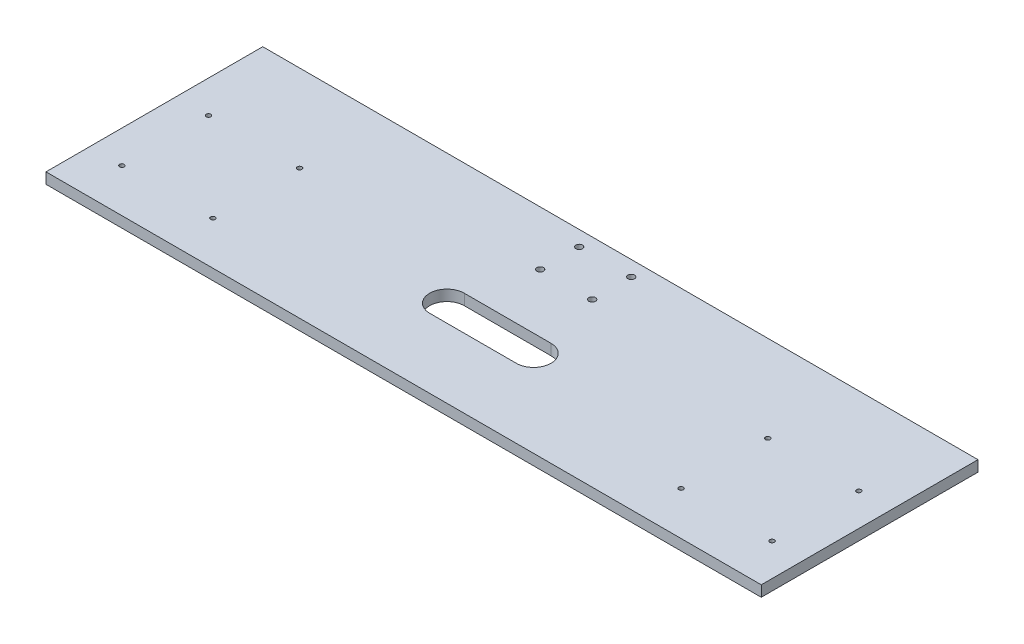
ISO-10303-21;
HEADER;
FILE_DESCRIPTION(('STEP AP214'),'2;1');
FILE_NAME('part.step','',(''),(''),'','','');
FILE_SCHEMA(('AUTOMOTIVE_DESIGN { 1 0 10303 214 1 1 1 1 }'));
ENDSEC;
DATA;
#1=APPLICATION_CONTEXT('core data for automotive mechanical design processes');
#2=APPLICATION_PROTOCOL_DEFINITION('international standard','automotive_design',2000,#1);
#3=PRODUCT_CONTEXT('',#1,'mechanical');
#4=PRODUCT('Part','Part','',(#3));
#5=PRODUCT_RELATED_PRODUCT_CATEGORY('part','',(#4));
#6=PRODUCT_DEFINITION_FORMATION('','',#4);
#7=PRODUCT_DEFINITION_CONTEXT('part definition',#1,'design');
#8=PRODUCT_DEFINITION('design','',#6,#7);
#9=PRODUCT_DEFINITION_SHAPE('','',#8);
#10=(LENGTH_UNIT() NAMED_UNIT(*) SI_UNIT(.MILLI.,.METRE.));
#11=(NAMED_UNIT(*) PLANE_ANGLE_UNIT() SI_UNIT($,.RADIAN.));
#12=(NAMED_UNIT(*) SI_UNIT($,.STERADIAN.) SOLID_ANGLE_UNIT());
#13=UNCERTAINTY_MEASURE_WITH_UNIT(LENGTH_MEASURE(1.E-05),#10,'distance_accuracy_value','');
#14=(GEOMETRIC_REPRESENTATION_CONTEXT(3) GLOBAL_UNCERTAINTY_ASSIGNED_CONTEXT((#13)) GLOBAL_UNIT_ASSIGNED_CONTEXT((#10,
#11,#12)) REPRESENTATION_CONTEXT('',''));
#15=CARTESIAN_POINT('',(0.,0.,0.));
#16=DIRECTION('',(0.,0.,1.));
#17=DIRECTION('',(1.,0.,0.));
#18=AXIS2_PLACEMENT_3D('',#15,#16,#17);
#19=CARTESIAN_POINT('',(-155.369649805448,5.,90.2723735408561));
#20=DIRECTION('',(1.,0.,0.));
#21=DIRECTION('',(0.,0.,-1.));
#22=AXIS2_PLACEMENT_3D('',#19,#20,#21);
#23=PLANE('',#22);
#24=DIRECTION('',(0.,0.,1.));
#25=VECTOR('',#24,1.);
#26=CARTESIAN_POINT('',(-155.369649805448,0.,90.2723735408561));
#27=LINE('',#26,#25);
#28=CARTESIAN_POINT('',(-155.369649805448,0.,90.2723735408561));
#29=VERTEX_POINT('',#28);
#30=CARTESIAN_POINT('',(-155.369649805447,0.,190.272373540856));
#31=VERTEX_POINT('',#30);
#32=EDGE_CURVE('E203',#29,#31,#27,.T.);
#33=ORIENTED_EDGE('',*,*,#32,.T.);
#34=DIRECTION('',(0.,-1.,0.));
#35=VECTOR('',#34,1.);
#36=CARTESIAN_POINT('',(-155.369649805447,5.,190.272373540856));
#37=LINE('',#36,#35);
#38=CARTESIAN_POINT('',(-155.369649805447,5.,190.272373540856));
#39=VERTEX_POINT('',#38);
#40=EDGE_CURVE('E11',#39,#31,#37,.T.);
#41=ORIENTED_EDGE('',*,*,#40,.F.);
#42=DIRECTION('',(0.,0.,1.));
#43=VECTOR('',#42,1.);
#44=CARTESIAN_POINT('',(-155.369649805448,5.,90.2723735408561));
#45=LINE('',#44,#43);
#46=CARTESIAN_POINT('',(-155.369649805448,5.,90.2723735408561));
#47=VERTEX_POINT('',#46);
#48=EDGE_CURVE('E206',#47,#39,#45,.T.);
#49=ORIENTED_EDGE('',*,*,#48,.F.);
#50=DIRECTION('',(0.,-1.,0.));
#51=VECTOR('',#50,1.);
#52=CARTESIAN_POINT('',(-155.369649805448,5.,90.2723735408561));
#53=LINE('',#52,#51);
#54=EDGE_CURVE('E216',#47,#29,#53,.T.);
#55=ORIENTED_EDGE('',*,*,#54,.T.);
#56=EDGE_LOOP('',(#33,#41,#49,#55));
#57=FACE_BOUND('',#56,.T.);
#58=ADVANCED_FACE('F35',(#57),#23,.F.);
#59=CARTESIAN_POINT('',(-155.369649805447,5.,190.272373540856));
#60=DIRECTION('',(0.,0.,-1.));
#61=DIRECTION('',(-1.,0.,0.));
#62=AXIS2_PLACEMENT_3D('',#59,#60,#61);
#63=PLANE('',#62);
#64=DIRECTION('',(1.,0.,0.));
#65=VECTOR('',#64,1.);
#66=CARTESIAN_POINT('',(-155.369649805447,0.,190.272373540856));
#67=LINE('',#66,#65);
#68=CARTESIAN_POINT('',(174.630350194553,0.,190.272373540856));
#69=VERTEX_POINT('',#68);
#70=EDGE_CURVE('E219',#31,#69,#67,.T.);
#71=ORIENTED_EDGE('',*,*,#70,.T.);
#72=DIRECTION('',(0.,-1.,0.));
#73=VECTOR('',#72,1.);
#74=CARTESIAN_POINT('',(174.630350194553,5.,190.272373540856));
#75=LINE('',#74,#73);
#76=CARTESIAN_POINT('',(174.630350194553,5.,190.272373540856));
#77=VERTEX_POINT('',#76);
#78=EDGE_CURVE('E42',#77,#69,#75,.T.);
#79=ORIENTED_EDGE('',*,*,#78,.F.);
#80=DIRECTION('',(1.,0.,0.));
#81=VECTOR('',#80,1.);
#82=CARTESIAN_POINT('',(-155.369649805447,5.,190.272373540856));
#83=LINE('',#82,#81);
#84=EDGE_CURVE('E209',#39,#77,#83,.T.);
#85=ORIENTED_EDGE('',*,*,#84,.F.);
#86=ORIENTED_EDGE('',*,*,#40,.T.);
#87=EDGE_LOOP('',(#71,#79,#85,#86));
#88=FACE_BOUND('',#87,.T.);
#89=ADVANCED_FACE('F248',(#88),#63,.F.);
#90=CARTESIAN_POINT('',(174.630350194553,5.,90.2723735408561));
#91=DIRECTION('',(-1.,0.,0.));
#92=DIRECTION('',(0.,0.,1.));
#93=AXIS2_PLACEMENT_3D('',#90,#91,#92);
#94=PLANE('',#93);
#95=DIRECTION('',(0.,0.,-1.));
#96=VECTOR('',#95,1.);
#97=CARTESIAN_POINT('',(174.630350194553,0.,90.2723735408561));
#98=LINE('',#97,#96);
#99=CARTESIAN_POINT('',(174.630350194553,0.,90.2723735408561));
#100=VERTEX_POINT('',#99);
#101=EDGE_CURVE('E221',#69,#100,#98,.T.);
#102=ORIENTED_EDGE('',*,*,#101,.T.);
#103=DIRECTION('',(0.,-1.,0.));
#104=VECTOR('',#103,1.);
#105=CARTESIAN_POINT('',(174.630350194553,5.,90.2723735408561));
#106=LINE('',#105,#104);
#107=CARTESIAN_POINT('',(174.630350194553,5.,90.2723735408561));
#108=VERTEX_POINT('',#107);
#109=EDGE_CURVE('E226',#108,#100,#106,.T.);
#110=ORIENTED_EDGE('',*,*,#109,.F.);
#111=DIRECTION('',(0.,0.,-1.));
#112=VECTOR('',#111,1.);
#113=CARTESIAN_POINT('',(174.630350194553,5.,90.2723735408561));
#114=LINE('',#113,#112);
#115=EDGE_CURVE('E212',#77,#108,#114,.T.);
#116=ORIENTED_EDGE('',*,*,#115,.F.);
#117=ORIENTED_EDGE('',*,*,#78,.T.);
#118=EDGE_LOOP('',(#102,#110,#116,#117));
#119=FACE_BOUND('',#118,.T.);
#120=ADVANCED_FACE('F233',(#119),#94,.F.);
#121=CARTESIAN_POINT('',(-155.369649805448,5.,90.2723735408561));
#122=DIRECTION('',(0.,0.,1.));
#123=DIRECTION('',(1.,0.,0.));
#124=AXIS2_PLACEMENT_3D('',#121,#122,#123);
#125=PLANE('',#124);
#126=DIRECTION('',(-1.,0.,0.));
#127=VECTOR('',#126,1.);
#128=CARTESIAN_POINT('',(-155.369649805448,0.,90.2723735408561));
#129=LINE('',#128,#127);
#130=EDGE_CURVE('E210',#100,#29,#129,.T.);
#131=ORIENTED_EDGE('',*,*,#130,.T.);
#132=ORIENTED_EDGE('',*,*,#54,.F.);
#133=DIRECTION('',(-1.,0.,0.));
#134=VECTOR('',#133,1.);
#135=CARTESIAN_POINT('',(-155.369649805448,5.,90.2723735408561));
#136=LINE('',#135,#134);
#137=EDGE_CURVE('E214',#108,#47,#136,.T.);
#138=ORIENTED_EDGE('',*,*,#137,.F.);
#139=ORIENTED_EDGE('',*,*,#109,.T.);
#140=EDGE_LOOP('',(#131,#132,#138,#139));
#141=FACE_BOUND('',#140,.T.);
#142=ADVANCED_FACE('F241',(#141),#125,.F.);
#143=CARTESIAN_POINT('',(0.,5.,0.));
#144=DIRECTION('',(0.,1.,0.));
#145=DIRECTION('',(0.,0.,1.));
#146=AXIS2_PLACEMENT_3D('',#143,#144,#145);
#147=PLANE('',#146);
#148=CARTESIAN_POINT('',(117.630350194553,5.,170.272373540856));
#149=DIRECTION('',(0.,1.,0.));
#150=DIRECTION('',(0.,0.,-1.));
#151=AXIS2_PLACEMENT_3D('',#148,#149,#150);
#152=CIRCLE('',#151,1.04999999999999);
#153=CARTESIAN_POINT('',(117.630350194553,5.,169.222373540856));
#154=VERTEX_POINT('',#153);
#155=EDGE_CURVE('E142',#154,#154,#152,.T.);
#156=ORIENTED_EDGE('',*,*,#155,.F.);
#157=EDGE_LOOP('',(#156));
#158=FACE_BOUND('',#157,.T.);
#159=CARTESIAN_POINT('',(159.630350194553,5.,130.272373540856));
#160=DIRECTION('',(0.,1.,0.));
#161=DIRECTION('',(0.,0.,1.));
#162=AXIS2_PLACEMENT_3D('',#159,#160,#161);
#163=CIRCLE('',#162,1.04999999999999);
#164=CARTESIAN_POINT('',(159.630350194553,5.,131.322373540856));
#165=VERTEX_POINT('',#164);
#166=EDGE_CURVE('E148',#165,#165,#163,.T.);
#167=ORIENTED_EDGE('',*,*,#166,.F.);
#168=EDGE_LOOP('',(#167));
#169=FACE_BOUND('',#168,.T.);
#170=CARTESIAN_POINT('',(159.630350194553,5.,170.272373540856));
#171=DIRECTION('',(0.,1.,0.));
#172=DIRECTION('',(0.,0.,-1.));
#173=AXIS2_PLACEMENT_3D('',#170,#171,#172);
#174=CIRCLE('',#173,1.04999999999999);
#175=CARTESIAN_POINT('',(159.630350194553,5.,169.222373540856));
#176=VERTEX_POINT('',#175);
#177=EDGE_CURVE('E123',#176,#176,#174,.T.);
#178=ORIENTED_EDGE('',*,*,#177,.F.);
#179=EDGE_LOOP('',(#178));
#180=FACE_BOUND('',#179,.T.);
#181=CARTESIAN_POINT('',(-10.3696498054475,5.,150.272373540856));
#182=DIRECTION('',(0.,1.,0.));
#183=DIRECTION('',(0.,0.,1.));
#184=AXIS2_PLACEMENT_3D('',#181,#182,#183);
#185=CIRCLE('',#184,8.00000000000001);
#186=CARTESIAN_POINT('',(-10.3696498054475,5.,142.272373540856));
#187=VERTEX_POINT('',#186);
#188=CARTESIAN_POINT('',(-10.3696498054475,5.,158.272373540856));
#189=VERTEX_POINT('',#188);
#190=EDGE_CURVE('E49',#187,#189,#185,.T.);
#191=ORIENTED_EDGE('',*,*,#190,.F.);
#192=DIRECTION('',(-1.,0.,0.));
#193=VECTOR('',#192,1.);
#194=CARTESIAN_POINT('',(-10.3696498054475,5.,142.272373540856));
#195=LINE('',#194,#193);
#196=CARTESIAN_POINT('',(29.6303501945525,5.,142.272373540856));
#197=VERTEX_POINT('',#196);
#198=EDGE_CURVE('E117',#197,#187,#195,.T.);
#199=ORIENTED_EDGE('',*,*,#198,.F.);
#200=CARTESIAN_POINT('',(29.6303501945525,5.,150.272373540856));
#201=DIRECTION('',(0.,1.,0.));
#202=DIRECTION('',(0.,0.,1.));
#203=AXIS2_PLACEMENT_3D('',#200,#201,#202);
#204=CIRCLE('',#203,8.00000000000001);
#205=CARTESIAN_POINT('',(29.6303501945525,5.,158.272373540856));
#206=VERTEX_POINT('',#205);
#207=EDGE_CURVE('E120',#206,#197,#204,.T.);
#208=ORIENTED_EDGE('',*,*,#207,.F.);
#209=DIRECTION('',(1.,0.,0.));
#210=VECTOR('',#209,1.);
#211=CARTESIAN_POINT('',(-10.3696498054475,5.,158.272373540856));
#212=LINE('',#211,#210);
#213=EDGE_CURVE('E129',#189,#206,#212,.T.);
#214=ORIENTED_EDGE('',*,*,#213,.F.);
#215=EDGE_LOOP('',(#191,#199,#208,#214));
#216=FACE_BOUND('',#215,.T.);
#217=CARTESIAN_POINT('',(-140.369649805448,5.,130.272373540856));
#218=DIRECTION('',(0.,1.,0.));
#219=DIRECTION('',(0.,0.,-1.));
#220=AXIS2_PLACEMENT_3D('',#217,#218,#219);
#221=CIRCLE('',#220,1.04999999999999);
#222=CARTESIAN_POINT('',(-140.369649805448,5.,129.222373540856));
#223=VERTEX_POINT('',#222);
#224=EDGE_CURVE('E168',#223,#223,#221,.T.);
#225=ORIENTED_EDGE('',*,*,#224,.F.);
#226=EDGE_LOOP('',(#225));
#227=FACE_BOUND('',#226,.T.);
#228=CARTESIAN_POINT('',(-98.3696498054475,5.,170.272373540856));
#229=DIRECTION('',(0.,1.,0.));
#230=DIRECTION('',(0.,0.,1.));
#231=AXIS2_PLACEMENT_3D('',#228,#229,#230);
#232=CIRCLE('',#231,1.04999999999999);
#233=CARTESIAN_POINT('',(-98.3696498054475,5.,171.322373540856));
#234=VERTEX_POINT('',#233);
#235=EDGE_CURVE('E155',#234,#234,#232,.T.);
#236=ORIENTED_EDGE('',*,*,#235,.F.);
#237=EDGE_LOOP('',(#236));
#238=FACE_BOUND('',#237,.T.);
#239=CARTESIAN_POINT('',(-98.3696498054475,5.,130.272373540856));
#240=DIRECTION('',(0.,1.,0.));
#241=DIRECTION('',(0.,0.,-1.));
#242=AXIS2_PLACEMENT_3D('',#239,#240,#241);
#243=CIRCLE('',#242,1.04999999999999);
#244=CARTESIAN_POINT('',(-98.3696498054475,5.,129.222373540856));
#245=VERTEX_POINT('',#244);
#246=EDGE_CURVE('E156',#245,#245,#243,.T.);
#247=ORIENTED_EDGE('',*,*,#246,.F.);
#248=EDGE_LOOP('',(#247));
#249=FACE_BOUND('',#248,.T.);
#250=CARTESIAN_POINT('',(117.630350194553,5.,130.272373540856));
#251=DIRECTION('',(0.,1.,0.));
#252=DIRECTION('',(0.,0.,1.));
#253=AXIS2_PLACEMENT_3D('',#250,#251,#252);
#254=CIRCLE('',#253,1.04999999999999);
#255=CARTESIAN_POINT('',(117.630350194553,5.,131.322373540856));
#256=VERTEX_POINT('',#255);
#257=EDGE_CURVE('E141',#256,#256,#254,.T.);
#258=ORIENTED_EDGE('',*,*,#257,.F.);
#259=EDGE_LOOP('',(#258));
#260=FACE_BOUND('',#259,.T.);
#261=CARTESIAN_POINT('',(-140.369649805448,5.,170.272373540856));
#262=DIRECTION('',(0.,1.,0.));
#263=DIRECTION('',(0.,0.,1.));
#264=AXIS2_PLACEMENT_3D('',#261,#262,#263);
#265=CIRCLE('',#264,1.04999999999999);
#266=CARTESIAN_POINT('',(-140.369649805448,5.,171.322373540856));
#267=VERTEX_POINT('',#266);
#268=EDGE_CURVE('E167',#267,#267,#265,.T.);
#269=ORIENTED_EDGE('',*,*,#268,.F.);
#270=EDGE_LOOP('',(#269));
#271=FACE_BOUND('',#270,.T.);
#272=CARTESIAN_POINT('',(21.6303501945525,5.,97.2723735408561));
#273=DIRECTION('',(0.,1.,0.));
#274=DIRECTION('',(0.,0.,-1.));
#275=AXIS2_PLACEMENT_3D('',#272,#273,#274);
#276=CIRCLE('',#275,1.515);
#277=CARTESIAN_POINT('',(21.6303501945525,5.,95.7573735408561));
#278=VERTEX_POINT('',#277);
#279=EDGE_CURVE('E186',#278,#278,#276,.T.);
#280=ORIENTED_EDGE('',*,*,#279,.F.);
#281=EDGE_LOOP('',(#280));
#282=FACE_BOUND('',#281,.T.);
#283=CARTESIAN_POINT('',(-2.36964980544749,5.,115.272373540856));
#284=DIRECTION('',(0.,1.,0.));
#285=DIRECTION('',(0.,0.,1.));
#286=AXIS2_PLACEMENT_3D('',#283,#284,#285);
#287=CIRCLE('',#286,1.51499999999999);
#288=CARTESIAN_POINT('',(-2.36964980544749,5.,116.787373540856));
#289=VERTEX_POINT('',#288);
#290=EDGE_CURVE('E192',#289,#289,#287,.T.);
#291=ORIENTED_EDGE('',*,*,#290,.F.);
#292=EDGE_LOOP('',(#291));
#293=FACE_BOUND('',#292,.T.);
#294=CARTESIAN_POINT('',(21.6303501945525,5.,115.272373540856));
#295=DIRECTION('',(0.,1.,0.));
#296=DIRECTION('',(0.,0.,-1.));
#297=AXIS2_PLACEMENT_3D('',#294,#295,#296);
#298=CIRCLE('',#297,1.515);
#299=CARTESIAN_POINT('',(21.6303501945525,5.,113.757373540856));
#300=VERTEX_POINT('',#299);
#301=EDGE_CURVE('E179',#300,#300,#298,.T.);
#302=ORIENTED_EDGE('',*,*,#301,.F.);
#303=EDGE_LOOP('',(#302));
#304=FACE_BOUND('',#303,.T.);
#305=CARTESIAN_POINT('',(-2.36964980544749,5.,97.2723735408561));
#306=DIRECTION('',(0.,1.,0.));
#307=DIRECTION('',(0.,0.,1.));
#308=AXIS2_PLACEMENT_3D('',#305,#306,#307);
#309=CIRCLE('',#308,1.51499999999999);
#310=CARTESIAN_POINT('',(-2.36964980544749,5.,98.7873735408561));
#311=VERTEX_POINT('',#310);
#312=EDGE_CURVE('E185',#311,#311,#309,.T.);
#313=ORIENTED_EDGE('',*,*,#312,.F.);
#314=EDGE_LOOP('',(#313));
#315=FACE_BOUND('',#314,.T.);
#316=ORIENTED_EDGE('',*,*,#48,.T.);
#317=ORIENTED_EDGE('',*,*,#84,.T.);
#318=ORIENTED_EDGE('',*,*,#115,.T.);
#319=ORIENTED_EDGE('',*,*,#137,.T.);
#320=EDGE_LOOP('',(#316,#317,#318,#319));
#321=FACE_BOUND('',#320,.T.);
#322=ADVANCED_FACE('F247',(#158,#169,#180,#216,#227,#238,#249,#260,#271,#282,#293,#304,#315,
#321),#147,.T.);
#323=CARTESIAN_POINT('',(0.,0.,0.));
#324=DIRECTION('',(0.,1.,0.));
#325=DIRECTION('',(0.,0.,1.));
#326=AXIS2_PLACEMENT_3D('',#323,#324,#325);
#327=PLANE('',#326);
#328=CARTESIAN_POINT('',(117.630350194553,0.,170.272373540856));
#329=DIRECTION('',(0.,1.,0.));
#330=DIRECTION('',(0.,0.,-1.));
#331=AXIS2_PLACEMENT_3D('',#328,#329,#330);
#332=CIRCLE('',#331,1.04999999999999);
#333=CARTESIAN_POINT('',(117.630350194553,0.,169.222373540856));
#334=VERTEX_POINT('',#333);
#335=EDGE_CURVE('E138',#334,#334,#332,.T.);
#336=ORIENTED_EDGE('',*,*,#335,.T.);
#337=EDGE_LOOP('',(#336));
#338=FACE_BOUND('',#337,.T.);
#339=CARTESIAN_POINT('',(159.630350194553,0.,130.272373540856));
#340=DIRECTION('',(0.,1.,0.));
#341=DIRECTION('',(0.,0.,1.));
#342=AXIS2_PLACEMENT_3D('',#339,#340,#341);
#343=CIRCLE('',#342,1.04999999999999);
#344=CARTESIAN_POINT('',(159.630350194553,0.,131.322373540856));
#345=VERTEX_POINT('',#344);
#346=EDGE_CURVE('E145',#345,#345,#343,.T.);
#347=ORIENTED_EDGE('',*,*,#346,.T.);
#348=EDGE_LOOP('',(#347));
#349=FACE_BOUND('',#348,.T.);
#350=CARTESIAN_POINT('',(159.630350194553,0.,170.272373540856));
#351=DIRECTION('',(0.,1.,0.));
#352=DIRECTION('',(0.,0.,-1.));
#353=AXIS2_PLACEMENT_3D('',#350,#351,#352);
#354=CIRCLE('',#353,1.04999999999999);
#355=CARTESIAN_POINT('',(159.630350194553,0.,169.222373540856));
#356=VERTEX_POINT('',#355);
#357=EDGE_CURVE('E151',#356,#356,#354,.T.);
#358=ORIENTED_EDGE('',*,*,#357,.T.);
#359=EDGE_LOOP('',(#358));
#360=FACE_BOUND('',#359,.T.);
#361=DIRECTION('',(-1.,0.,0.));
#362=VECTOR('',#361,1.);
#363=CARTESIAN_POINT('',(-10.3696498054475,0.,142.272373540856));
#364=LINE('',#363,#362);
#365=CARTESIAN_POINT('',(29.6303501945525,0.,142.272373540856));
#366=VERTEX_POINT('',#365);
#367=CARTESIAN_POINT('',(-10.3696498054475,0.,142.272373540856));
#368=VERTEX_POINT('',#367);
#369=EDGE_CURVE('E107',#366,#368,#364,.T.);
#370=ORIENTED_EDGE('',*,*,#369,.T.);
#371=CARTESIAN_POINT('',(-10.3696498054475,0.,150.272373540856));
#372=DIRECTION('',(0.,1.,0.));
#373=DIRECTION('',(0.,0.,1.));
#374=AXIS2_PLACEMENT_3D('',#371,#372,#373);
#375=CIRCLE('',#374,8.00000000000001);
#376=CARTESIAN_POINT('',(-10.3696498054475,0.,158.272373540856));
#377=VERTEX_POINT('',#376);
#378=EDGE_CURVE('E101',#368,#377,#375,.T.);
#379=ORIENTED_EDGE('',*,*,#378,.T.);
#380=DIRECTION('',(1.,0.,0.));
#381=VECTOR('',#380,1.);
#382=CARTESIAN_POINT('',(-10.3696498054475,0.,158.272373540856));
#383=LINE('',#382,#381);
#384=CARTESIAN_POINT('',(29.6303501945525,0.,158.272373540856));
#385=VERTEX_POINT('',#384);
#386=EDGE_CURVE('E110',#377,#385,#383,.T.);
#387=ORIENTED_EDGE('',*,*,#386,.T.);
#388=CARTESIAN_POINT('',(29.6303501945525,0.,150.272373540856));
#389=DIRECTION('',(0.,1.,0.));
#390=DIRECTION('',(0.,0.,1.));
#391=AXIS2_PLACEMENT_3D('',#388,#389,#390);
#392=CIRCLE('',#391,8.00000000000001);
#393=EDGE_CURVE('E57',#385,#366,#392,.T.);
#394=ORIENTED_EDGE('',*,*,#393,.T.);
#395=EDGE_LOOP('',(#370,#379,#387,#394));
#396=FACE_BOUND('',#395,.T.);
#397=CARTESIAN_POINT('',(-140.369649805448,0.,130.272373540856));
#398=DIRECTION('',(0.,1.,0.));
#399=DIRECTION('',(0.,0.,-1.));
#400=AXIS2_PLACEMENT_3D('',#397,#398,#399);
#401=CIRCLE('',#400,1.04999999999999);
#402=CARTESIAN_POINT('',(-140.369649805448,0.,129.222373540856));
#403=VERTEX_POINT('',#402);
#404=EDGE_CURVE('E164',#403,#403,#401,.T.);
#405=ORIENTED_EDGE('',*,*,#404,.T.);
#406=EDGE_LOOP('',(#405));
#407=FACE_BOUND('',#406,.T.);
#408=CARTESIAN_POINT('',(-98.3696498054475,0.,170.272373540856));
#409=DIRECTION('',(0.,1.,0.));
#410=DIRECTION('',(0.,0.,1.));
#411=AXIS2_PLACEMENT_3D('',#408,#409,#410);
#412=CIRCLE('',#411,1.04999999999999);
#413=CARTESIAN_POINT('',(-98.3696498054475,0.,171.322373540856));
#414=VERTEX_POINT('',#413);
#415=EDGE_CURVE('E171',#414,#414,#412,.T.);
#416=ORIENTED_EDGE('',*,*,#415,.T.);
#417=EDGE_LOOP('',(#416));
#418=FACE_BOUND('',#417,.T.);
#419=CARTESIAN_POINT('',(-98.3696498054475,0.,130.272373540856));
#420=DIRECTION('',(0.,1.,0.));
#421=DIRECTION('',(0.,0.,-1.));
#422=AXIS2_PLACEMENT_3D('',#419,#420,#421);
#423=CIRCLE('',#422,1.04999999999999);
#424=CARTESIAN_POINT('',(-98.3696498054475,0.,129.222373540856));
#425=VERTEX_POINT('',#424);
#426=EDGE_CURVE('E152',#425,#425,#423,.T.);
#427=ORIENTED_EDGE('',*,*,#426,.T.);
#428=EDGE_LOOP('',(#427));
#429=FACE_BOUND('',#428,.T.);
#430=CARTESIAN_POINT('',(117.630350194553,0.,130.272373540856));
#431=DIRECTION('',(0.,1.,0.));
#432=DIRECTION('',(0.,0.,1.));
#433=AXIS2_PLACEMENT_3D('',#430,#431,#432);
#434=CIRCLE('',#433,1.04999999999999);
#435=CARTESIAN_POINT('',(117.630350194553,0.,131.322373540856));
#436=VERTEX_POINT('',#435);
#437=EDGE_CURVE('E159',#436,#436,#434,.T.);
#438=ORIENTED_EDGE('',*,*,#437,.T.);
#439=EDGE_LOOP('',(#438));
#440=FACE_BOUND('',#439,.T.);
#441=CARTESIAN_POINT('',(-140.369649805448,0.,170.272373540856));
#442=DIRECTION('',(0.,1.,0.));
#443=DIRECTION('',(0.,0.,1.));
#444=AXIS2_PLACEMENT_3D('',#441,#442,#443);
#445=CIRCLE('',#444,1.04999999999999);
#446=CARTESIAN_POINT('',(-140.369649805448,0.,171.322373540856));
#447=VERTEX_POINT('',#446);
#448=EDGE_CURVE('E176',#447,#447,#445,.T.);
#449=ORIENTED_EDGE('',*,*,#448,.T.);
#450=EDGE_LOOP('',(#449));
#451=FACE_BOUND('',#450,.T.);
#452=CARTESIAN_POINT('',(21.6303501945525,0.,97.2723735408561));
#453=DIRECTION('',(0.,1.,0.));
#454=DIRECTION('',(0.,0.,-1.));
#455=AXIS2_PLACEMENT_3D('',#452,#453,#454);
#456=CIRCLE('',#455,1.515);
#457=CARTESIAN_POINT('',(21.6303501945525,0.,95.7573735408561));
#458=VERTEX_POINT('',#457);
#459=EDGE_CURVE('E182',#458,#458,#456,.T.);
#460=ORIENTED_EDGE('',*,*,#459,.T.);
#461=EDGE_LOOP('',(#460));
#462=FACE_BOUND('',#461,.T.);
#463=CARTESIAN_POINT('',(-2.36964980544749,0.,115.272373540856));
#464=DIRECTION('',(0.,1.,0.));
#465=DIRECTION('',(0.,0.,1.));
#466=AXIS2_PLACEMENT_3D('',#463,#464,#465);
#467=CIRCLE('',#466,1.51499999999999);
#468=CARTESIAN_POINT('',(-2.36964980544749,0.,116.787373540856));
#469=VERTEX_POINT('',#468);
#470=EDGE_CURVE('E189',#469,#469,#467,.T.);
#471=ORIENTED_EDGE('',*,*,#470,.T.);
#472=EDGE_LOOP('',(#471));
#473=FACE_BOUND('',#472,.T.);
#474=CARTESIAN_POINT('',(21.6303501945525,0.,115.272373540856));
#475=DIRECTION('',(0.,1.,0.));
#476=DIRECTION('',(0.,0.,-1.));
#477=AXIS2_PLACEMENT_3D('',#474,#475,#476);
#478=CIRCLE('',#477,1.515);
#479=CARTESIAN_POINT('',(21.6303501945525,0.,113.757373540856));
#480=VERTEX_POINT('',#479);
#481=EDGE_CURVE('E195',#480,#480,#478,.T.);
#482=ORIENTED_EDGE('',*,*,#481,.T.);
#483=EDGE_LOOP('',(#482));
#484=FACE_BOUND('',#483,.T.);
#485=CARTESIAN_POINT('',(-2.36964980544749,0.,97.2723735408561));
#486=DIRECTION('',(0.,1.,0.));
#487=DIRECTION('',(0.,0.,1.));
#488=AXIS2_PLACEMENT_3D('',#485,#486,#487);
#489=CIRCLE('',#488,1.51499999999999);
#490=CARTESIAN_POINT('',(-2.36964980544749,0.,98.7873735408561));
#491=VERTEX_POINT('',#490);
#492=EDGE_CURVE('E200',#491,#491,#489,.T.);
#493=ORIENTED_EDGE('',*,*,#492,.T.);
#494=EDGE_LOOP('',(#493));
#495=FACE_BOUND('',#494,.T.);
#496=ORIENTED_EDGE('',*,*,#32,.F.);
#497=ORIENTED_EDGE('',*,*,#130,.F.);
#498=ORIENTED_EDGE('',*,*,#101,.F.);
#499=ORIENTED_EDGE('',*,*,#70,.F.);
#500=EDGE_LOOP('',(#496,#497,#498,#499));
#501=FACE_BOUND('',#500,.T.);
#502=ADVANCED_FACE('F114',(#338,#349,#360,#396,#407,#418,#429,#440,#451,#462,#473,#484,#495,
#501),#327,.F.);
#503=CARTESIAN_POINT('',(-2.36964980544749,0.,97.2723735408561));
#504=DIRECTION('',(0.,1.,0.));
#505=DIRECTION('',(0.,0.,1.));
#506=AXIS2_PLACEMENT_3D('',#503,#504,#505);
#507=CYLINDRICAL_SURFACE('',#506,1.51499999999999);
#508=ORIENTED_EDGE('',*,*,#492,.F.);
#509=EDGE_LOOP('',(#508));
#510=FACE_BOUND('',#509,.T.);
#511=ORIENTED_EDGE('',*,*,#312,.T.);
#512=EDGE_LOOP('',(#511));
#513=FACE_BOUND('',#512,.T.);
#514=ADVANCED_FACE('F260',(#510,#513),#507,.F.);
#515=CARTESIAN_POINT('',(21.6303501945525,0.,115.272373540856));
#516=DIRECTION('',(0.,1.,0.));
#517=DIRECTION('',(0.,0.,1.));
#518=AXIS2_PLACEMENT_3D('',#515,#516,#517);
#519=CYLINDRICAL_SURFACE('',#518,1.515);
#520=ORIENTED_EDGE('',*,*,#481,.F.);
#521=EDGE_LOOP('',(#520));
#522=FACE_BOUND('',#521,.T.);
#523=ORIENTED_EDGE('',*,*,#301,.T.);
#524=EDGE_LOOP('',(#523));
#525=FACE_BOUND('',#524,.T.);
#526=ADVANCED_FACE('F267',(#522,#525),#519,.F.);
#527=CARTESIAN_POINT('',(-2.36964980544749,0.,115.272373540856));
#528=DIRECTION('',(0.,1.,0.));
#529=DIRECTION('',(0.,0.,1.));
#530=AXIS2_PLACEMENT_3D('',#527,#528,#529);
#531=CYLINDRICAL_SURFACE('',#530,1.51499999999999);
#532=ORIENTED_EDGE('',*,*,#470,.F.);
#533=EDGE_LOOP('',(#532));
#534=FACE_BOUND('',#533,.T.);
#535=ORIENTED_EDGE('',*,*,#290,.T.);
#536=EDGE_LOOP('',(#535));
#537=FACE_BOUND('',#536,.T.);
#538=ADVANCED_FACE('F271',(#534,#537),#531,.F.);
#539=CARTESIAN_POINT('',(21.6303501945525,0.,97.2723735408561));
#540=DIRECTION('',(0.,1.,0.));
#541=DIRECTION('',(0.,0.,1.));
#542=AXIS2_PLACEMENT_3D('',#539,#540,#541);
#543=CYLINDRICAL_SURFACE('',#542,1.515);
#544=ORIENTED_EDGE('',*,*,#459,.F.);
#545=EDGE_LOOP('',(#544));
#546=FACE_BOUND('',#545,.T.);
#547=ORIENTED_EDGE('',*,*,#279,.T.);
#548=EDGE_LOOP('',(#547));
#549=FACE_BOUND('',#548,.T.);
#550=ADVANCED_FACE('F275',(#546,#549),#543,.F.);
#551=CARTESIAN_POINT('',(-140.369649805448,0.,170.272373540856));
#552=DIRECTION('',(0.,1.,0.));
#553=DIRECTION('',(0.,0.,1.));
#554=AXIS2_PLACEMENT_3D('',#551,#552,#553);
#555=CYLINDRICAL_SURFACE('',#554,1.04999999999999);
#556=ORIENTED_EDGE('',*,*,#448,.F.);
#557=EDGE_LOOP('',(#556));
#558=FACE_BOUND('',#557,.T.);
#559=ORIENTED_EDGE('',*,*,#268,.T.);
#560=EDGE_LOOP('',(#559));
#561=FACE_BOUND('',#560,.T.);
#562=ADVANCED_FACE('F279',(#558,#561),#555,.F.);
#563=CARTESIAN_POINT('',(117.630350194553,0.,130.272373540856));
#564=DIRECTION('',(0.,1.,0.));
#565=DIRECTION('',(0.,0.,1.));
#566=AXIS2_PLACEMENT_3D('',#563,#564,#565);
#567=CYLINDRICAL_SURFACE('',#566,1.04999999999999);
#568=ORIENTED_EDGE('',*,*,#437,.F.);
#569=EDGE_LOOP('',(#568));
#570=FACE_BOUND('',#569,.T.);
#571=ORIENTED_EDGE('',*,*,#257,.T.);
#572=EDGE_LOOP('',(#571));
#573=FACE_BOUND('',#572,.T.);
#574=ADVANCED_FACE('F283',(#570,#573),#567,.F.);
#575=CARTESIAN_POINT('',(-98.3696498054475,0.,130.272373540856));
#576=DIRECTION('',(0.,1.,0.));
#577=DIRECTION('',(0.,0.,1.));
#578=AXIS2_PLACEMENT_3D('',#575,#576,#577);
#579=CYLINDRICAL_SURFACE('',#578,1.04999999999999);
#580=ORIENTED_EDGE('',*,*,#426,.F.);
#581=EDGE_LOOP('',(#580));
#582=FACE_BOUND('',#581,.T.);
#583=ORIENTED_EDGE('',*,*,#246,.T.);
#584=EDGE_LOOP('',(#583));
#585=FACE_BOUND('',#584,.T.);
#586=ADVANCED_FACE('F289',(#582,#585),#579,.F.);
#587=CARTESIAN_POINT('',(-98.3696498054475,0.,170.272373540856));
#588=DIRECTION('',(0.,1.,0.));
#589=DIRECTION('',(0.,0.,1.));
#590=AXIS2_PLACEMENT_3D('',#587,#588,#589);
#591=CYLINDRICAL_SURFACE('',#590,1.04999999999999);
#592=ORIENTED_EDGE('',*,*,#415,.F.);
#593=EDGE_LOOP('',(#592));
#594=FACE_BOUND('',#593,.T.);
#595=ORIENTED_EDGE('',*,*,#235,.T.);
#596=EDGE_LOOP('',(#595));
#597=FACE_BOUND('',#596,.T.);
#598=ADVANCED_FACE('F285',(#594,#597),#591,.F.);
#599=CARTESIAN_POINT('',(-140.369649805448,0.,130.272373540856));
#600=DIRECTION('',(0.,1.,0.));
#601=DIRECTION('',(0.,0.,1.));
#602=AXIS2_PLACEMENT_3D('',#599,#600,#601);
#603=CYLINDRICAL_SURFACE('',#602,1.04999999999999);
#604=ORIENTED_EDGE('',*,*,#404,.F.);
#605=EDGE_LOOP('',(#604));
#606=FACE_BOUND('',#605,.T.);
#607=ORIENTED_EDGE('',*,*,#224,.T.);
#608=EDGE_LOOP('',(#607));
#609=FACE_BOUND('',#608,.T.);
#610=ADVANCED_FACE('F288',(#606,#609),#603,.F.);
#611=CARTESIAN_POINT('',(-10.3696498054475,0.,150.272373540856));
#612=DIRECTION('',(0.,1.,0.));
#613=DIRECTION('',(0.,0.,1.));
#614=AXIS2_PLACEMENT_3D('',#611,#612,#613);
#615=CYLINDRICAL_SURFACE('',#614,8.00000000000001);
#616=ORIENTED_EDGE('',*,*,#190,.T.);
#617=DIRECTION('',(0.,1.,0.));
#618=VECTOR('',#617,1.);
#619=CARTESIAN_POINT('',(-10.3696498054475,0.,158.272373540856));
#620=LINE('',#619,#618);
#621=EDGE_CURVE('E97',#377,#189,#620,.T.);
#622=ORIENTED_EDGE('',*,*,#621,.F.);
#623=ORIENTED_EDGE('',*,*,#378,.F.);
#624=DIRECTION('',(0.,1.,0.));
#625=VECTOR('',#624,1.);
#626=CARTESIAN_POINT('',(-10.3696498054475,0.,142.272373540856));
#627=LINE('',#626,#625);
#628=EDGE_CURVE('E133',#368,#187,#627,.T.);
#629=ORIENTED_EDGE('',*,*,#628,.T.);
#630=EDGE_LOOP('',(#616,#622,#623,#629));
#631=FACE_BOUND('',#630,.T.);
#632=ADVANCED_FACE('F99',(#631),#615,.F.);
#633=CARTESIAN_POINT('',(-10.3696498054475,0.,142.272373540856));
#634=DIRECTION('',(0.,0.,-1.));
#635=DIRECTION('',(-1.,0.,0.));
#636=AXIS2_PLACEMENT_3D('',#633,#634,#635);
#637=PLANE('',#636);
#638=ORIENTED_EDGE('',*,*,#198,.T.);
#639=ORIENTED_EDGE('',*,*,#628,.F.);
#640=ORIENTED_EDGE('',*,*,#369,.F.);
#641=DIRECTION('',(0.,1.,0.));
#642=VECTOR('',#641,1.);
#643=CARTESIAN_POINT('',(29.6303501945525,0.,142.272373540856));
#644=LINE('',#643,#642);
#645=EDGE_CURVE('E135',#366,#197,#644,.T.);
#646=ORIENTED_EDGE('',*,*,#645,.T.);
#647=EDGE_LOOP('',(#638,#639,#640,#646));
#648=FACE_BOUND('',#647,.T.);
#649=ADVANCED_FACE('F311',(#648),#637,.F.);
#650=CARTESIAN_POINT('',(29.6303501945525,0.,150.272373540856));
#651=DIRECTION('',(0.,1.,0.));
#652=DIRECTION('',(0.,0.,1.));
#653=AXIS2_PLACEMENT_3D('',#650,#651,#652);
#654=CYLINDRICAL_SURFACE('',#653,8.00000000000001);
#655=ORIENTED_EDGE('',*,*,#207,.T.);
#656=ORIENTED_EDGE('',*,*,#645,.F.);
#657=ORIENTED_EDGE('',*,*,#393,.F.);
#658=DIRECTION('',(0.,1.,0.));
#659=VECTOR('',#658,1.);
#660=CARTESIAN_POINT('',(29.6303501945525,0.,158.272373540856));
#661=LINE('',#660,#659);
#662=EDGE_CURVE('E106',#385,#206,#661,.T.);
#663=ORIENTED_EDGE('',*,*,#662,.T.);
#664=EDGE_LOOP('',(#655,#656,#657,#663));
#665=FACE_BOUND('',#664,.T.);
#666=ADVANCED_FACE('F314',(#665),#654,.F.);
#667=CARTESIAN_POINT('',(-10.3696498054475,0.,158.272373540856));
#668=DIRECTION('',(0.,0.,1.));
#669=DIRECTION('',(1.,0.,0.));
#670=AXIS2_PLACEMENT_3D('',#667,#668,#669);
#671=PLANE('',#670);
#672=ORIENTED_EDGE('',*,*,#213,.T.);
#673=ORIENTED_EDGE('',*,*,#662,.F.);
#674=ORIENTED_EDGE('',*,*,#386,.F.);
#675=ORIENTED_EDGE('',*,*,#621,.T.);
#676=EDGE_LOOP('',(#672,#673,#674,#675));
#677=FACE_BOUND('',#676,.T.);
#678=ADVANCED_FACE('F111',(#677),#671,.F.);
#679=CARTESIAN_POINT('',(159.630350194553,0.,170.272373540856));
#680=DIRECTION('',(0.,1.,0.));
#681=DIRECTION('',(0.,0.,1.));
#682=AXIS2_PLACEMENT_3D('',#679,#680,#681);
#683=CYLINDRICAL_SURFACE('',#682,1.04999999999999);
#684=ORIENTED_EDGE('',*,*,#357,.F.);
#685=EDGE_LOOP('',(#684));
#686=FACE_BOUND('',#685,.T.);
#687=ORIENTED_EDGE('',*,*,#177,.T.);
#688=EDGE_LOOP('',(#687));
#689=FACE_BOUND('',#688,.T.);
#690=ADVANCED_FACE('F304',(#686,#689),#683,.F.);
#691=CARTESIAN_POINT('',(159.630350194553,0.,130.272373540856));
#692=DIRECTION('',(0.,1.,0.));
#693=DIRECTION('',(0.,0.,1.));
#694=AXIS2_PLACEMENT_3D('',#691,#692,#693);
#695=CYLINDRICAL_SURFACE('',#694,1.04999999999999);
#696=ORIENTED_EDGE('',*,*,#346,.F.);
#697=EDGE_LOOP('',(#696));
#698=FACE_BOUND('',#697,.T.);
#699=ORIENTED_EDGE('',*,*,#166,.T.);
#700=EDGE_LOOP('',(#699));
#701=FACE_BOUND('',#700,.T.);
#702=ADVANCED_FACE('F300',(#698,#701),#695,.F.);
#703=CARTESIAN_POINT('',(117.630350194553,0.,170.272373540856));
#704=DIRECTION('',(0.,1.,0.));
#705=DIRECTION('',(0.,0.,1.));
#706=AXIS2_PLACEMENT_3D('',#703,#704,#705);
#707=CYLINDRICAL_SURFACE('',#706,1.04999999999999);
#708=ORIENTED_EDGE('',*,*,#335,.F.);
#709=EDGE_LOOP('',(#708));
#710=FACE_BOUND('',#709,.T.);
#711=ORIENTED_EDGE('',*,*,#155,.T.);
#712=EDGE_LOOP('',(#711));
#713=FACE_BOUND('',#712,.T.);
#714=ADVANCED_FACE('F303',(#710,#713),#707,.F.);
#715=CLOSED_SHELL('',(#58,#89,#120,#142,#322,#502,#514,#526,#538,#550,#562,#574,#586,#598,#610,
#632,#649,#666,#678,#690,#702,#714));
#716=MANIFOLD_SOLID_BREP('B2',#715);
#717=ADVANCED_BREP_SHAPE_REPRESENTATION('',(#18,#716),#14);
#718=SHAPE_DEFINITION_REPRESENTATION(#9,#717);
ENDSEC;
END-ISO-10303-21;
